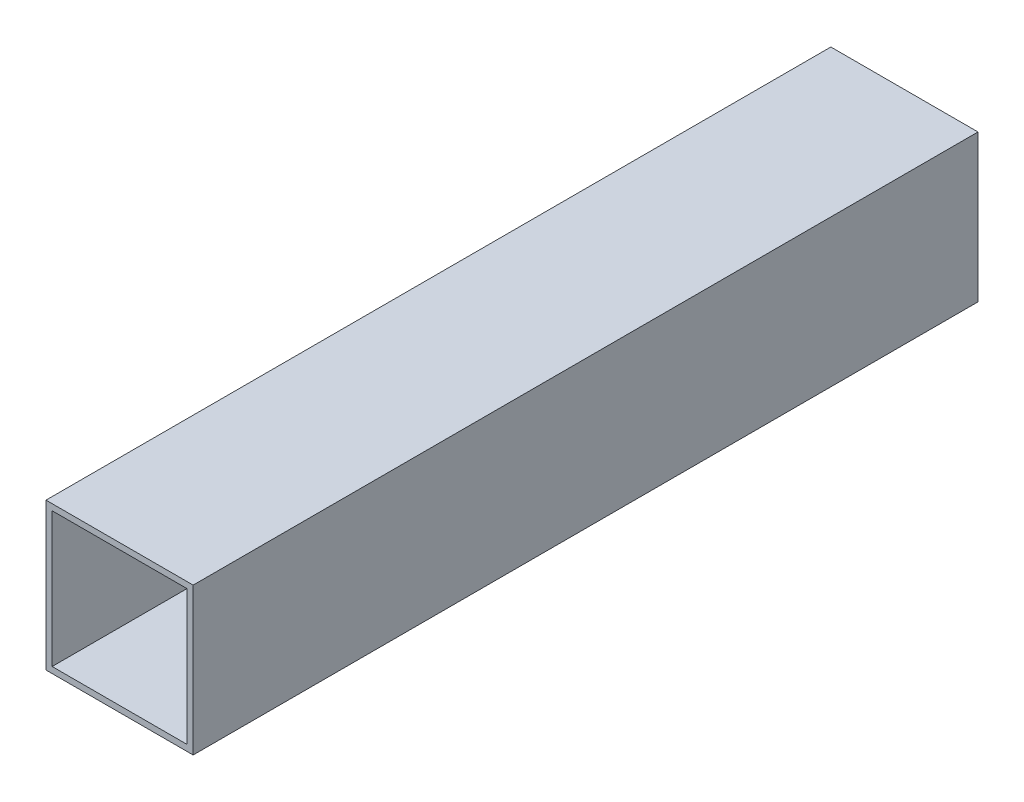
ISO-10303-21;
HEADER;
FILE_DESCRIPTION(('STEP AP214'),'2;1');
FILE_NAME('part.step','',(''),(''),'','','');
FILE_SCHEMA(('AUTOMOTIVE_DESIGN { 1 0 10303 214 1 1 1 1 }'));
ENDSEC;
DATA;
#1=APPLICATION_CONTEXT('core data for automotive mechanical design processes');
#2=APPLICATION_PROTOCOL_DEFINITION('international standard','automotive_design',2000,#1);
#3=PRODUCT_CONTEXT('',#1,'mechanical');
#4=PRODUCT('Part','Part','',(#3));
#5=PRODUCT_RELATED_PRODUCT_CATEGORY('part','',(#4));
#6=PRODUCT_DEFINITION_FORMATION('','',#4);
#7=PRODUCT_DEFINITION_CONTEXT('part definition',#1,'design');
#8=PRODUCT_DEFINITION('design','',#6,#7);
#9=PRODUCT_DEFINITION_SHAPE('','',#8);
#10=(LENGTH_UNIT() NAMED_UNIT(*) SI_UNIT(.MILLI.,.METRE.));
#11=(NAMED_UNIT(*) PLANE_ANGLE_UNIT() SI_UNIT($,.RADIAN.));
#12=(NAMED_UNIT(*) SI_UNIT($,.STERADIAN.) SOLID_ANGLE_UNIT());
#13=UNCERTAINTY_MEASURE_WITH_UNIT(LENGTH_MEASURE(1.E-05),#10,'distance_accuracy_value','');
#14=(GEOMETRIC_REPRESENTATION_CONTEXT(3) GLOBAL_UNCERTAINTY_ASSIGNED_CONTEXT((#13)) GLOBAL_UNIT_ASSIGNED_CONTEXT((#10,
#11,#12)) REPRESENTATION_CONTEXT('',''));
#15=CARTESIAN_POINT('',(0.,0.,0.));
#16=DIRECTION('',(0.,0.,1.));
#17=DIRECTION('',(1.,0.,0.));
#18=AXIS2_PLACEMENT_3D('',#15,#16,#17);
#19=CARTESIAN_POINT('',(0.,0.,203.2));
#20=DIRECTION('',(0.,0.,-1.));
#21=DIRECTION('',(-1.,0.,0.));
#22=AXIS2_PLACEMENT_3D('',#19,#20,#21);
#23=PLANE('',#22);
#24=DIRECTION('',(0.,-1.,0.));
#25=VECTOR('',#24,1.);
#26=CARTESIAN_POINT('',(0.,0.,203.2));
#27=LINE('',#26,#25);
#28=CARTESIAN_POINT('',(0.,38.1,203.2));
#29=VERTEX_POINT('',#28);
#30=CARTESIAN_POINT('',(0.,0.,203.2));
#31=VERTEX_POINT('',#30);
#32=EDGE_CURVE('E136',#29,#31,#27,.T.);
#33=ORIENTED_EDGE('',*,*,#32,.T.);
#34=DIRECTION('',(1.,0.,0.));
#35=VECTOR('',#34,1.);
#36=CARTESIAN_POINT('',(0.,0.,203.2));
#37=LINE('',#36,#35);
#38=CARTESIAN_POINT('',(38.1,0.,203.2));
#39=VERTEX_POINT('',#38);
#40=EDGE_CURVE('E139',#31,#39,#37,.T.);
#41=ORIENTED_EDGE('',*,*,#40,.T.);
#42=DIRECTION('',(0.,1.,0.));
#43=VECTOR('',#42,1.);
#44=CARTESIAN_POINT('',(38.1,0.,203.2));
#45=LINE('',#44,#43);
#46=CARTESIAN_POINT('',(38.1,38.1,203.2));
#47=VERTEX_POINT('',#46);
#48=EDGE_CURVE('E142',#39,#47,#45,.T.);
#49=ORIENTED_EDGE('',*,*,#48,.T.);
#50=DIRECTION('',(-1.,0.,0.));
#51=VECTOR('',#50,1.);
#52=CARTESIAN_POINT('',(0.,38.1,203.2));
#53=LINE('',#52,#51);
#54=EDGE_CURVE('E144',#47,#29,#53,.T.);
#55=ORIENTED_EDGE('',*,*,#54,.T.);
#56=EDGE_LOOP('',(#33,#41,#49,#55));
#57=FACE_BOUND('',#56,.T.);
#58=DIRECTION('',(0.,-1.,0.));
#59=VECTOR('',#58,1.);
#60=CARTESIAN_POINT('',(1.5875,1.5875,203.2));
#61=LINE('',#60,#59);
#62=CARTESIAN_POINT('',(1.5875,36.5125,203.2));
#63=VERTEX_POINT('',#62);
#64=CARTESIAN_POINT('',(1.5875,1.5875,203.2));
#65=VERTEX_POINT('',#64);
#66=EDGE_CURVE('E100',#63,#65,#61,.T.);
#67=ORIENTED_EDGE('',*,*,#66,.F.);
#68=DIRECTION('',(-1.,0.,0.));
#69=VECTOR('',#68,1.);
#70=CARTESIAN_POINT('',(1.5875,36.5125,203.2));
#71=LINE('',#70,#69);
#72=CARTESIAN_POINT('',(36.5125,36.5125,203.2));
#73=VERTEX_POINT('',#72);
#74=EDGE_CURVE('E122',#73,#63,#71,.T.);
#75=ORIENTED_EDGE('',*,*,#74,.F.);
#76=DIRECTION('',(0.,1.,0.));
#77=VECTOR('',#76,1.);
#78=CARTESIAN_POINT('',(36.5125,1.5875,203.2));
#79=LINE('',#78,#77);
#80=CARTESIAN_POINT('',(36.5125,1.5875,203.2));
#81=VERTEX_POINT('',#80);
#82=EDGE_CURVE('E120',#81,#73,#79,.T.);
#83=ORIENTED_EDGE('',*,*,#82,.F.);
#84=DIRECTION('',(1.,0.,0.));
#85=VECTOR('',#84,1.);
#86=CARTESIAN_POINT('',(1.5875,1.5875,203.2));
#87=LINE('',#86,#85);
#88=EDGE_CURVE('E108',#65,#81,#87,.T.);
#89=ORIENTED_EDGE('',*,*,#88,.F.);
#90=EDGE_LOOP('',(#67,#75,#83,#89));
#91=FACE_BOUND('',#90,.T.);
#92=ADVANCED_FACE('F35',(#57,#91),#23,.F.);
#93=CARTESIAN_POINT('',(0.,0.,0.));
#94=DIRECTION('',(0.,0.,-1.));
#95=DIRECTION('',(-1.,0.,0.));
#96=AXIS2_PLACEMENT_3D('',#93,#94,#95);
#97=PLANE('',#96);
#98=DIRECTION('',(0.,-1.,0.));
#99=VECTOR('',#98,1.);
#100=CARTESIAN_POINT('',(0.,0.,0.));
#101=LINE('',#100,#99);
#102=CARTESIAN_POINT('',(0.,38.1,0.));
#103=VERTEX_POINT('',#102);
#104=CARTESIAN_POINT('',(0.,0.,0.));
#105=VERTEX_POINT('',#104);
#106=EDGE_CURVE('E116',#103,#105,#101,.T.);
#107=ORIENTED_EDGE('',*,*,#106,.F.);
#108=DIRECTION('',(-1.,0.,0.));
#109=VECTOR('',#108,1.);
#110=CARTESIAN_POINT('',(0.,38.1,0.));
#111=LINE('',#110,#109);
#112=CARTESIAN_POINT('',(38.1,38.1,0.));
#113=VERTEX_POINT('',#112);
#114=EDGE_CURVE('E140',#113,#103,#111,.T.);
#115=ORIENTED_EDGE('',*,*,#114,.F.);
#116=DIRECTION('',(0.,1.,0.));
#117=VECTOR('',#116,1.);
#118=CARTESIAN_POINT('',(38.1,0.,0.));
#119=LINE('',#118,#117);
#120=CARTESIAN_POINT('',(38.1,0.,0.));
#121=VERTEX_POINT('',#120);
#122=EDGE_CURVE('E151',#121,#113,#119,.T.);
#123=ORIENTED_EDGE('',*,*,#122,.F.);
#124=DIRECTION('',(1.,0.,0.));
#125=VECTOR('',#124,1.);
#126=CARTESIAN_POINT('',(0.,0.,0.));
#127=LINE('',#126,#125);
#128=EDGE_CURVE('E149',#105,#121,#127,.T.);
#129=ORIENTED_EDGE('',*,*,#128,.F.);
#130=EDGE_LOOP('',(#107,#115,#123,#129));
#131=FACE_BOUND('',#130,.T.);
#132=DIRECTION('',(-1.,0.,0.));
#133=VECTOR('',#132,1.);
#134=CARTESIAN_POINT('',(1.5875,36.5125,0.));
#135=LINE('',#134,#133);
#136=CARTESIAN_POINT('',(36.5125,36.5125,0.));
#137=VERTEX_POINT('',#136);
#138=CARTESIAN_POINT('',(1.5875,36.5125,0.));
#139=VERTEX_POINT('',#138);
#140=EDGE_CURVE('E109',#137,#139,#135,.T.);
#141=ORIENTED_EDGE('',*,*,#140,.T.);
#142=DIRECTION('',(0.,-1.,0.));
#143=VECTOR('',#142,1.);
#144=CARTESIAN_POINT('',(1.5875,1.5875,0.));
#145=LINE('',#144,#143);
#146=CARTESIAN_POINT('',(1.5875,1.5875,0.));
#147=VERTEX_POINT('',#146);
#148=EDGE_CURVE('E58',#139,#147,#145,.T.);
#149=ORIENTED_EDGE('',*,*,#148,.T.);
#150=DIRECTION('',(1.,0.,0.));
#151=VECTOR('',#150,1.);
#152=CARTESIAN_POINT('',(1.5875,1.5875,0.));
#153=LINE('',#152,#151);
#154=CARTESIAN_POINT('',(36.5125,1.5875,0.));
#155=VERTEX_POINT('',#154);
#156=EDGE_CURVE('E115',#147,#155,#153,.T.);
#157=ORIENTED_EDGE('',*,*,#156,.T.);
#158=DIRECTION('',(0.,1.,0.));
#159=VECTOR('',#158,1.);
#160=CARTESIAN_POINT('',(36.5125,1.5875,0.));
#161=LINE('',#160,#159);
#162=EDGE_CURVE('E128',#155,#137,#161,.T.);
#163=ORIENTED_EDGE('',*,*,#162,.T.);
#164=EDGE_LOOP('',(#141,#149,#157,#163));
#165=FACE_BOUND('',#164,.T.);
#166=ADVANCED_FACE('F169',(#131,#165),#97,.T.);
#167=CARTESIAN_POINT('',(0.,0.,203.2));
#168=DIRECTION('',(1.,0.,0.));
#169=DIRECTION('',(0.,0.,-1.));
#170=AXIS2_PLACEMENT_3D('',#167,#168,#169);
#171=PLANE('',#170);
#172=ORIENTED_EDGE('',*,*,#106,.T.);
#173=DIRECTION('',(0.,0.,-1.));
#174=VECTOR('',#173,1.);
#175=CARTESIAN_POINT('',(0.,0.,203.2));
#176=LINE('',#175,#174);
#177=EDGE_CURVE('E11',#31,#105,#176,.T.);
#178=ORIENTED_EDGE('',*,*,#177,.F.);
#179=ORIENTED_EDGE('',*,*,#32,.F.);
#180=DIRECTION('',(0.,0.,-1.));
#181=VECTOR('',#180,1.);
#182=CARTESIAN_POINT('',(0.,38.1,203.2));
#183=LINE('',#182,#181);
#184=EDGE_CURVE('E146',#29,#103,#183,.T.);
#185=ORIENTED_EDGE('',*,*,#184,.T.);
#186=EDGE_LOOP('',(#172,#178,#179,#185));
#187=FACE_BOUND('',#186,.T.);
#188=ADVANCED_FACE('F37',(#187),#171,.F.);
#189=CARTESIAN_POINT('',(0.,0.,203.2));
#190=DIRECTION('',(0.,1.,0.));
#191=DIRECTION('',(0.,0.,1.));
#192=AXIS2_PLACEMENT_3D('',#189,#190,#191);
#193=PLANE('',#192);
#194=ORIENTED_EDGE('',*,*,#128,.T.);
#195=DIRECTION('',(0.,0.,-1.));
#196=VECTOR('',#195,1.);
#197=CARTESIAN_POINT('',(38.1,0.,203.2));
#198=LINE('',#197,#196);
#199=EDGE_CURVE('E43',#39,#121,#198,.T.);
#200=ORIENTED_EDGE('',*,*,#199,.F.);
#201=ORIENTED_EDGE('',*,*,#40,.F.);
#202=ORIENTED_EDGE('',*,*,#177,.T.);
#203=EDGE_LOOP('',(#194,#200,#201,#202));
#204=FACE_BOUND('',#203,.T.);
#205=ADVANCED_FACE('F179',(#204),#193,.F.);
#206=CARTESIAN_POINT('',(38.1,0.,203.2));
#207=DIRECTION('',(-1.,0.,0.));
#208=DIRECTION('',(0.,0.,1.));
#209=AXIS2_PLACEMENT_3D('',#206,#207,#208);
#210=PLANE('',#209);
#211=ORIENTED_EDGE('',*,*,#122,.T.);
#212=DIRECTION('',(0.,0.,-1.));
#213=VECTOR('',#212,1.);
#214=CARTESIAN_POINT('',(38.1,38.1,203.2));
#215=LINE('',#214,#213);
#216=EDGE_CURVE('E156',#47,#113,#215,.T.);
#217=ORIENTED_EDGE('',*,*,#216,.F.);
#218=ORIENTED_EDGE('',*,*,#48,.F.);
#219=ORIENTED_EDGE('',*,*,#199,.T.);
#220=EDGE_LOOP('',(#211,#217,#218,#219));
#221=FACE_BOUND('',#220,.T.);
#222=ADVANCED_FACE('F163',(#221),#210,.F.);
#223=CARTESIAN_POINT('',(0.,38.1,203.2));
#224=DIRECTION('',(0.,-1.,0.));
#225=DIRECTION('',(0.,0.,-1.));
#226=AXIS2_PLACEMENT_3D('',#223,#224,#225);
#227=PLANE('',#226);
#228=ORIENTED_EDGE('',*,*,#114,.T.);
#229=ORIENTED_EDGE('',*,*,#184,.F.);
#230=ORIENTED_EDGE('',*,*,#54,.F.);
#231=ORIENTED_EDGE('',*,*,#216,.T.);
#232=EDGE_LOOP('',(#228,#229,#230,#231));
#233=FACE_BOUND('',#232,.T.);
#234=ADVANCED_FACE('F173',(#233),#227,.F.);
#235=CARTESIAN_POINT('',(1.5875,1.5875,203.2));
#236=DIRECTION('',(1.,0.,0.));
#237=DIRECTION('',(0.,1.,0.));
#238=AXIS2_PLACEMENT_3D('',#235,#236,#237);
#239=PLANE('',#238);
#240=ORIENTED_EDGE('',*,*,#148,.F.);
#241=DIRECTION('',(0.,0.,-1.));
#242=VECTOR('',#241,1.);
#243=CARTESIAN_POINT('',(1.5875,36.5125,203.2));
#244=LINE('',#243,#242);
#245=EDGE_CURVE('E104',#63,#139,#244,.T.);
#246=ORIENTED_EDGE('',*,*,#245,.F.);
#247=ORIENTED_EDGE('',*,*,#66,.T.);
#248=DIRECTION('',(0.,0.,-1.));
#249=VECTOR('',#248,1.);
#250=CARTESIAN_POINT('',(1.5875,1.5875,203.2));
#251=LINE('',#250,#249);
#252=EDGE_CURVE('E103',#65,#147,#251,.T.);
#253=ORIENTED_EDGE('',*,*,#252,.T.);
#254=EDGE_LOOP('',(#240,#246,#247,#253));
#255=FACE_BOUND('',#254,.T.);
#256=ADVANCED_FACE('F102',(#255),#239,.T.);
#257=CARTESIAN_POINT('',(1.5875,1.5875,203.2));
#258=DIRECTION('',(0.,1.,0.));
#259=DIRECTION('',(0.,0.,1.));
#260=AXIS2_PLACEMENT_3D('',#257,#258,#259);
#261=PLANE('',#260);
#262=ORIENTED_EDGE('',*,*,#156,.F.);
#263=ORIENTED_EDGE('',*,*,#252,.F.);
#264=ORIENTED_EDGE('',*,*,#88,.T.);
#265=DIRECTION('',(0.,0.,-1.));
#266=VECTOR('',#265,1.);
#267=CARTESIAN_POINT('',(36.5125,1.5875,203.2));
#268=LINE('',#267,#266);
#269=EDGE_CURVE('E117',#81,#155,#268,.T.);
#270=ORIENTED_EDGE('',*,*,#269,.T.);
#271=EDGE_LOOP('',(#262,#263,#264,#270));
#272=FACE_BOUND('',#271,.T.);
#273=ADVANCED_FACE('F112',(#272),#261,.T.);
#274=CARTESIAN_POINT('',(36.5125,1.5875,203.2));
#275=DIRECTION('',(-1.,0.,0.));
#276=DIRECTION('',(0.,0.,1.));
#277=AXIS2_PLACEMENT_3D('',#274,#275,#276);
#278=PLANE('',#277);
#279=ORIENTED_EDGE('',*,*,#162,.F.);
#280=ORIENTED_EDGE('',*,*,#269,.F.);
#281=ORIENTED_EDGE('',*,*,#82,.T.);
#282=DIRECTION('',(0.,0.,-1.));
#283=VECTOR('',#282,1.);
#284=CARTESIAN_POINT('',(36.5125,36.5125,203.2));
#285=LINE('',#284,#283);
#286=EDGE_CURVE('E50',#73,#137,#285,.T.);
#287=ORIENTED_EDGE('',*,*,#286,.T.);
#288=EDGE_LOOP('',(#279,#280,#281,#287));
#289=FACE_BOUND('',#288,.T.);
#290=ADVANCED_FACE('F202',(#289),#278,.T.);
#291=CARTESIAN_POINT('',(1.5875,36.5125,203.2));
#292=DIRECTION('',(0.,-1.,0.));
#293=DIRECTION('',(0.,0.,-1.));
#294=AXIS2_PLACEMENT_3D('',#291,#292,#293);
#295=PLANE('',#294);
#296=ORIENTED_EDGE('',*,*,#140,.F.);
#297=ORIENTED_EDGE('',*,*,#286,.F.);
#298=ORIENTED_EDGE('',*,*,#74,.T.);
#299=ORIENTED_EDGE('',*,*,#245,.T.);
#300=EDGE_LOOP('',(#296,#297,#298,#299));
#301=FACE_BOUND('',#300,.T.);
#302=ADVANCED_FACE('F206',(#301),#295,.T.);
#303=CLOSED_SHELL('',(#92,#166,#188,#205,#222,#234,#256,#273,#290,#302));
#304=MANIFOLD_SOLID_BREP('B2',#303);
#305=ADVANCED_BREP_SHAPE_REPRESENTATION('',(#18,#304),#14);
#306=SHAPE_DEFINITION_REPRESENTATION(#9,#305);
ENDSEC;
END-ISO-10303-21;
